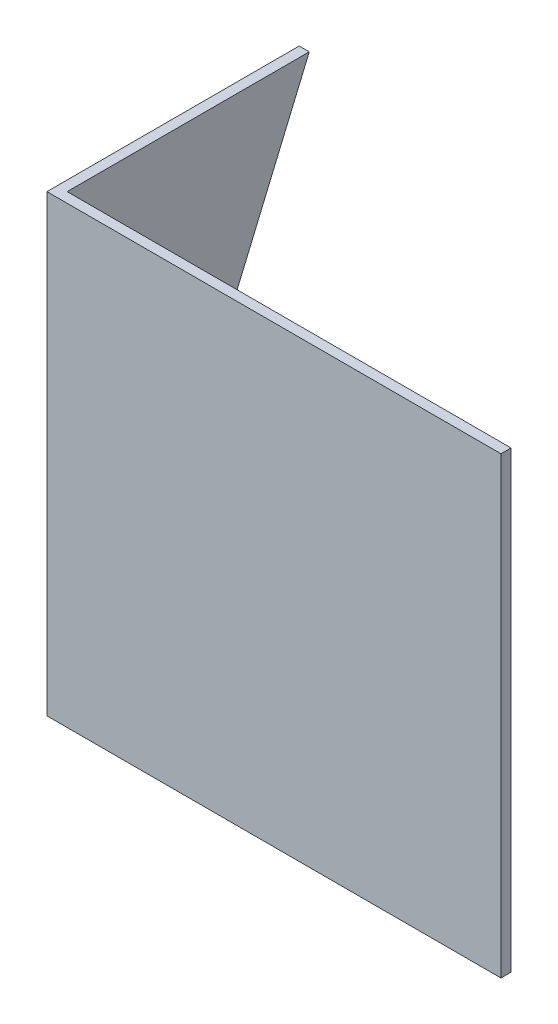
ISO-10303-21;
HEADER;
FILE_DESCRIPTION(('STEP AP214'),'2;1');
FILE_NAME('part.step','',(''),(''),'','','');
FILE_SCHEMA(('AUTOMOTIVE_DESIGN { 1 0 10303 214 1 1 1 1 }'));
ENDSEC;
DATA;
#1=APPLICATION_CONTEXT('core data for automotive mechanical design processes');
#2=APPLICATION_PROTOCOL_DEFINITION('international standard','automotive_design',2000,#1);
#3=PRODUCT_CONTEXT('',#1,'mechanical');
#4=PRODUCT('Part','Part','',(#3));
#5=PRODUCT_RELATED_PRODUCT_CATEGORY('part','',(#4));
#6=PRODUCT_DEFINITION_FORMATION('','',#4);
#7=PRODUCT_DEFINITION_CONTEXT('part definition',#1,'design');
#8=PRODUCT_DEFINITION('design','',#6,#7);
#9=PRODUCT_DEFINITION_SHAPE('','',#8);
#10=(LENGTH_UNIT() NAMED_UNIT(*) SI_UNIT(.MILLI.,.METRE.));
#11=(NAMED_UNIT(*) PLANE_ANGLE_UNIT() SI_UNIT($,.RADIAN.));
#12=(NAMED_UNIT(*) SI_UNIT($,.STERADIAN.) SOLID_ANGLE_UNIT());
#13=UNCERTAINTY_MEASURE_WITH_UNIT(LENGTH_MEASURE(1.E-05),#10,'distance_accuracy_value','');
#14=(GEOMETRIC_REPRESENTATION_CONTEXT(3) GLOBAL_UNCERTAINTY_ASSIGNED_CONTEXT((#13)) GLOBAL_UNIT_ASSIGNED_CONTEXT((#10,
#11,#12)) REPRESENTATION_CONTEXT('',''));
#15=CARTESIAN_POINT('',(0.,0.,0.));
#16=DIRECTION('',(0.,0.,1.));
#17=DIRECTION('',(1.,0.,0.));
#18=AXIS2_PLACEMENT_3D('',#15,#16,#17);
#19=CARTESIAN_POINT('',(0.,0.,0.));
#20=DIRECTION('',(0.,1.,0.));
#21=DIRECTION('',(0.,0.,1.));
#22=AXIS2_PLACEMENT_3D('',#19,#20,#21);
#23=PLANE('',#22);
#24=DIRECTION('',(0.,0.,1.));
#25=VECTOR('',#24,1.);
#26=CARTESIAN_POINT('',(-18.4036942663252,0.,-33.1673503287217));
#27=LINE('',#26,#25);
#28=CARTESIAN_POINT('',(-18.4036942663252,0.,5.03538313014283));
#29=VERTEX_POINT('',#28);
#30=CARTESIAN_POINT('',(-18.4036942663252,0.,16.8326496712783));
#31=VERTEX_POINT('',#30);
#32=EDGE_CURVE('E127',#29,#31,#27,.T.);
#33=ORIENTED_EDGE('',*,*,#32,.F.);
#34=DIRECTION('',(-1.,0.,0.));
#35=VECTOR('',#34,1.);
#36=CARTESIAN_POINT('',(71.5973057336749,0.,5.03538313014281));
#37=LINE('',#36,#35);
#38=CARTESIAN_POINT('',(-16.4036942663251,0.,5.03538313014283));
#39=VERTEX_POINT('',#38);
#40=EDGE_CURVE('E158',#39,#29,#37,.T.);
#41=ORIENTED_EDGE('',*,*,#40,.F.);
#42=DIRECTION('',(0.,0.,1.));
#43=VECTOR('',#42,1.);
#44=CARTESIAN_POINT('',(-16.4036942663252,0.,-33.1673503287217));
#45=LINE('',#44,#43);
#46=CARTESIAN_POINT('',(-16.4036942663252,0.,14.8326496712783));
#47=VERTEX_POINT('',#46);
#48=EDGE_CURVE('E140',#39,#47,#45,.T.);
#49=ORIENTED_EDGE('',*,*,#48,.T.);
#50=DIRECTION('',(-1.,0.,0.));
#51=VECTOR('',#50,1.);
#52=CARTESIAN_POINT('',(71.5963057336748,0.,14.8326496712783));
#53=LINE('',#52,#51);
#54=CARTESIAN_POINT('',(71.5963057336748,0.,14.8326496712783));
#55=VERTEX_POINT('',#54);
#56=EDGE_CURVE('E156',#55,#47,#53,.T.);
#57=ORIENTED_EDGE('',*,*,#56,.F.);
#58=DIRECTION('',(0.,0.,-1.));
#59=VECTOR('',#58,1.);
#60=CARTESIAN_POINT('',(71.5963057336748,0.,16.8326496712783));
#61=LINE('',#60,#59);
#62=CARTESIAN_POINT('',(71.5963057336748,0.,16.8326496712783));
#63=VERTEX_POINT('',#62);
#64=EDGE_CURVE('E102',#63,#55,#61,.T.);
#65=ORIENTED_EDGE('',*,*,#64,.F.);
#66=DIRECTION('',(1.,0.,0.));
#67=VECTOR('',#66,1.);
#68=CARTESIAN_POINT('',(-18.4036942663252,0.,16.8326496712783));
#69=LINE('',#68,#67);
#70=EDGE_CURVE('E134',#31,#63,#69,.T.);
#71=ORIENTED_EDGE('',*,*,#70,.F.);
#72=EDGE_LOOP('',(#33,#41,#49,#57,#65,#71));
#73=FACE_BOUND('',#72,.T.);
#74=ADVANCED_FACE('F67',(#73),#23,.F.);
#75=CARTESIAN_POINT('',(-18.4036942663252,90.,16.8326496712783));
#76=DIRECTION('',(0.,0.,-1.));
#77=DIRECTION('',(-1.,0.,0.));
#78=AXIS2_PLACEMENT_3D('',#75,#76,#77);
#79=PLANE('',#78);
#80=ORIENTED_EDGE('',*,*,#70,.T.);
#81=DIRECTION('',(0.,-1.,0.));
#82=VECTOR('',#81,1.);
#83=CARTESIAN_POINT('',(71.5963057336748,90.,16.8326496712783));
#84=LINE('',#83,#82);
#85=CARTESIAN_POINT('',(71.5963057336748,90.,16.8326496712783));
#86=VERTEX_POINT('',#85);
#87=EDGE_CURVE('E135',#86,#63,#84,.T.);
#88=ORIENTED_EDGE('',*,*,#87,.F.);
#89=DIRECTION('',(1.,0.,0.));
#90=VECTOR('',#89,1.);
#91=CARTESIAN_POINT('',(-18.4036942663252,90.,16.8326496712783));
#92=LINE('',#91,#90);
#93=CARTESIAN_POINT('',(-18.4036942663252,90.,16.8326496712783));
#94=VERTEX_POINT('',#93);
#95=EDGE_CURVE('E144',#94,#86,#92,.T.);
#96=ORIENTED_EDGE('',*,*,#95,.F.);
#97=DIRECTION('',(0.,-1.,0.));
#98=VECTOR('',#97,1.);
#99=CARTESIAN_POINT('',(-18.4036942663252,90.,16.8326496712783));
#100=LINE('',#99,#98);
#101=EDGE_CURVE('E76',#94,#31,#100,.T.);
#102=ORIENTED_EDGE('',*,*,#101,.T.);
#103=EDGE_LOOP('',(#80,#88,#96,#102));
#104=FACE_BOUND('',#103,.T.);
#105=ADVANCED_FACE('F143',(#104),#79,.F.);
#106=CARTESIAN_POINT('',(-18.4036942663252,90.,-33.1673503287217));
#107=DIRECTION('',(1.,0.,0.));
#108=DIRECTION('',(0.,0.,-1.));
#109=AXIS2_PLACEMENT_3D('',#106,#107,#108);
#110=PLANE('',#109);
#111=DIRECTION('',(0.,0.,1.));
#112=VECTOR('',#111,1.);
#113=CARTESIAN_POINT('',(-18.4036942663252,90.,-33.1673503287217));
#114=LINE('',#113,#112);
#115=CARTESIAN_POINT('',(-18.4036942663252,90.,-33.1673503287217));
#116=VERTEX_POINT('',#115);
#117=EDGE_CURVE('E163',#116,#94,#114,.T.);
#118=ORIENTED_EDGE('',*,*,#117,.F.);
#119=DIRECTION('',(0.,0.92050485345244,-0.390731128489275));
#120=VECTOR('',#119,1.);
#121=CARTESIAN_POINT('',(-18.4036942663252,90.,-33.1673503287217));
#122=LINE('',#121,#120);
#123=EDGE_CURVE('E132',#29,#116,#122,.T.);
#124=ORIENTED_EDGE('',*,*,#123,.F.);
#125=ORIENTED_EDGE('',*,*,#32,.T.);
#126=ORIENTED_EDGE('',*,*,#101,.F.);
#127=EDGE_LOOP('',(#118,#124,#125,#126));
#128=FACE_BOUND('',#127,.T.);
#129=ADVANCED_FACE('F130',(#128),#110,.F.);
#130=CARTESIAN_POINT('',(0.,90.,0.));
#131=DIRECTION('',(0.,1.,0.));
#132=DIRECTION('',(0.,0.,1.));
#133=AXIS2_PLACEMENT_3D('',#130,#131,#132);
#134=PLANE('',#133);
#135=ORIENTED_EDGE('',*,*,#95,.T.);
#136=DIRECTION('',(0.,0.,-1.));
#137=VECTOR('',#136,1.);
#138=CARTESIAN_POINT('',(71.5963057336748,90.,16.8326496712783));
#139=LINE('',#138,#137);
#140=CARTESIAN_POINT('',(71.5963057336748,90.,14.8326496712783));
#141=VERTEX_POINT('',#140);
#142=EDGE_CURVE('E153',#86,#141,#139,.T.);
#143=ORIENTED_EDGE('',*,*,#142,.T.);
#144=DIRECTION('',(-1.,0.,0.));
#145=VECTOR('',#144,1.);
#146=CARTESIAN_POINT('',(71.5963057336748,90.,14.8326496712783));
#147=LINE('',#146,#145);
#148=CARTESIAN_POINT('',(-16.4036942663252,90.,14.8326496712783));
#149=VERTEX_POINT('',#148);
#150=EDGE_CURVE('E151',#141,#149,#147,.T.);
#151=ORIENTED_EDGE('',*,*,#150,.T.);
#152=DIRECTION('',(0.,0.,1.));
#153=VECTOR('',#152,1.);
#154=CARTESIAN_POINT('',(-16.4036942663252,90.,-33.1673503287217));
#155=LINE('',#154,#153);
#156=CARTESIAN_POINT('',(-16.4036942663252,90.,-33.1673503287217));
#157=VERTEX_POINT('',#156);
#158=EDGE_CURVE('E147',#157,#149,#155,.T.);
#159=ORIENTED_EDGE('',*,*,#158,.F.);
#160=DIRECTION('',(1.,0.,0.));
#161=VECTOR('',#160,1.);
#162=CARTESIAN_POINT('',(-18.4036942663252,90.,-33.1673503287217));
#163=LINE('',#162,#161);
#164=EDGE_CURVE('E145',#116,#157,#163,.T.);
#165=ORIENTED_EDGE('',*,*,#164,.F.);
#166=ORIENTED_EDGE('',*,*,#117,.T.);
#167=EDGE_LOOP('',(#135,#143,#151,#159,#165,#166));
#168=FACE_BOUND('',#167,.T.);
#169=ADVANCED_FACE('F176',(#168),#134,.T.);
#170=CARTESIAN_POINT('',(-16.4036942663252,90.,-33.1673503287217));
#171=DIRECTION('',(1.,0.,0.));
#172=DIRECTION('',(0.,0.,-1.));
#173=AXIS2_PLACEMENT_3D('',#170,#171,#172);
#174=PLANE('',#173);
#175=DIRECTION('',(0.,0.92050485345244,-0.390731128489275));
#176=VECTOR('',#175,1.);
#177=CARTESIAN_POINT('',(-16.4036942663252,90.,-33.1673503287217));
#178=LINE('',#177,#176);
#179=EDGE_CURVE('E112',#39,#157,#178,.T.);
#180=ORIENTED_EDGE('',*,*,#179,.T.);
#181=ORIENTED_EDGE('',*,*,#158,.T.);
#182=DIRECTION('',(0.,-1.,0.));
#183=VECTOR('',#182,1.);
#184=CARTESIAN_POINT('',(-16.4036942663252,90.,14.8326496712783));
#185=LINE('',#184,#183);
#186=EDGE_CURVE('E12',#149,#47,#185,.T.);
#187=ORIENTED_EDGE('',*,*,#186,.T.);
#188=ORIENTED_EDGE('',*,*,#48,.F.);
#189=EDGE_LOOP('',(#180,#181,#187,#188));
#190=FACE_BOUND('',#189,.T.);
#191=ADVANCED_FACE('F165',(#190),#174,.T.);
#192=CARTESIAN_POINT('',(71.5963057336748,90.,16.8326496712783));
#193=DIRECTION('',(-1.,0.,0.));
#194=DIRECTION('',(0.,0.,1.));
#195=AXIS2_PLACEMENT_3D('',#192,#193,#194);
#196=PLANE('',#195);
#197=ORIENTED_EDGE('',*,*,#64,.T.);
#198=DIRECTION('',(0.,-1.,0.));
#199=VECTOR('',#198,1.);
#200=CARTESIAN_POINT('',(71.5963057336748,90.,14.8326496712783));
#201=LINE('',#200,#199);
#202=EDGE_CURVE('E155',#141,#55,#201,.T.);
#203=ORIENTED_EDGE('',*,*,#202,.F.);
#204=ORIENTED_EDGE('',*,*,#142,.F.);
#205=ORIENTED_EDGE('',*,*,#87,.T.);
#206=EDGE_LOOP('',(#197,#203,#204,#205));
#207=FACE_BOUND('',#206,.T.);
#208=ADVANCED_FACE('F179',(#207),#196,.F.);
#209=CARTESIAN_POINT('',(71.5963057336748,90.,14.8326496712783));
#210=DIRECTION('',(0.,0.,1.));
#211=DIRECTION('',(1.,0.,0.));
#212=AXIS2_PLACEMENT_3D('',#209,#210,#211);
#213=PLANE('',#212);
#214=ORIENTED_EDGE('',*,*,#186,.F.);
#215=ORIENTED_EDGE('',*,*,#150,.F.);
#216=ORIENTED_EDGE('',*,*,#202,.T.);
#217=ORIENTED_EDGE('',*,*,#56,.T.);
#218=EDGE_LOOP('',(#214,#215,#216,#217));
#219=FACE_BOUND('',#218,.T.);
#220=ADVANCED_FACE('F69',(#219),#213,.F.);
#221=CARTESIAN_POINT('',(71.5973057336748,90.,-33.1673503287217));
#222=DIRECTION('',(0.,0.390731128489275,0.92050485345244));
#223=DIRECTION('',(0.,-0.92050485345244,0.390731128489275));
#224=AXIS2_PLACEMENT_3D('',#221,#222,#223);
#225=PLANE('',#224);
#226=ORIENTED_EDGE('',*,*,#40,.T.);
#227=ORIENTED_EDGE('',*,*,#123,.T.);
#228=ORIENTED_EDGE('',*,*,#164,.T.);
#229=ORIENTED_EDGE('',*,*,#179,.F.);
#230=EDGE_LOOP('',(#226,#227,#228,#229));
#231=FACE_BOUND('',#230,.T.);
#232=ADVANCED_FACE('F175',(#231),#225,.F.);
#233=CLOSED_SHELL('',(#74,#105,#129,#169,#191,#208,#220,#232));
#234=MANIFOLD_SOLID_BREP('B2',#233);
#235=ADVANCED_BREP_SHAPE_REPRESENTATION('',(#18,#234),#14);
#236=SHAPE_DEFINITION_REPRESENTATION(#9,#235);
ENDSEC;
END-ISO-10303-21;
